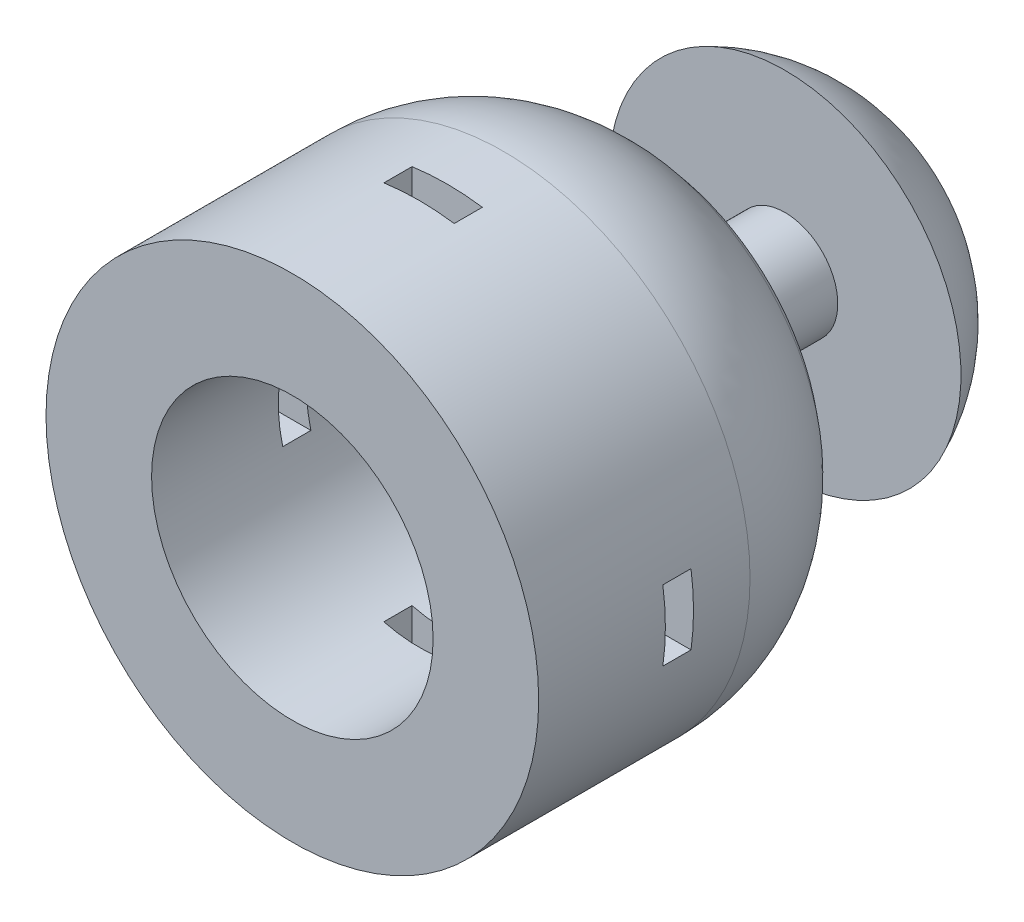
ISO-10303-21;
HEADER;
FILE_DESCRIPTION(('STEP AP214'),'2;1');
FILE_NAME('part.step','',(''),(''),'','','');
FILE_SCHEMA(('AUTOMOTIVE_DESIGN { 1 0 10303 214 1 1 1 1 }'));
ENDSEC;
DATA;
#1=APPLICATION_CONTEXT('core data for automotive mechanical design processes');
#2=APPLICATION_PROTOCOL_DEFINITION('international standard','automotive_design',2000,#1);
#3=PRODUCT_CONTEXT('',#1,'mechanical');
#4=PRODUCT('Part','Part','',(#3));
#5=PRODUCT_RELATED_PRODUCT_CATEGORY('part','',(#4));
#6=PRODUCT_DEFINITION_FORMATION('','',#4);
#7=PRODUCT_DEFINITION_CONTEXT('part definition',#1,'design');
#8=PRODUCT_DEFINITION('design','',#6,#7);
#9=PRODUCT_DEFINITION_SHAPE('','',#8);
#10=(LENGTH_UNIT() NAMED_UNIT(*) SI_UNIT(.MILLI.,.METRE.));
#11=(NAMED_UNIT(*) PLANE_ANGLE_UNIT() SI_UNIT($,.RADIAN.));
#12=(NAMED_UNIT(*) SI_UNIT($,.STERADIAN.) SOLID_ANGLE_UNIT());
#13=UNCERTAINTY_MEASURE_WITH_UNIT(LENGTH_MEASURE(1.E-05),#10,'distance_accuracy_value','');
#14=(GEOMETRIC_REPRESENTATION_CONTEXT(3) GLOBAL_UNCERTAINTY_ASSIGNED_CONTEXT((#13)) GLOBAL_UNIT_ASSIGNED_CONTEXT((#10,
#11,#12)) REPRESENTATION_CONTEXT('',''));
#15=CARTESIAN_POINT('',(0.,0.,0.));
#16=DIRECTION('',(0.,0.,1.));
#17=DIRECTION('',(1.,0.,0.));
#18=AXIS2_PLACEMENT_3D('',#15,#16,#17);
#19=CARTESIAN_POINT('',(0.,0.,400.));
#20=DIRECTION('',(0.,0.,1.));
#21=DIRECTION('',(1.,0.,0.));
#22=AXIS2_PLACEMENT_3D('',#19,#20,#21);
#23=PLANE('',#22);
#24=CARTESIAN_POINT('',(0.,0.,400.));
#25=DIRECTION('',(0.,0.,1.));
#26=DIRECTION('',(1.,0.,0.));
#27=AXIS2_PLACEMENT_3D('',#24,#25,#26);
#28=CIRCLE('',#27,350.);
#29=CARTESIAN_POINT('',(350.,0.,400.));
#30=VERTEX_POINT('',#29);
#31=EDGE_CURVE('E211',#30,#30,#28,.T.);
#32=ORIENTED_EDGE('',*,*,#31,.T.);
#33=EDGE_LOOP('',(#32));
#34=FACE_BOUND('',#33,.T.);
#35=CARTESIAN_POINT('',(0.,0.,400.));
#36=DIRECTION('',(0.,0.,1.));
#37=DIRECTION('',(1.,0.,0.));
#38=AXIS2_PLACEMENT_3D('',#35,#36,#37);
#39=CIRCLE('',#38,200.);
#40=CARTESIAN_POINT('',(200.,0.,400.));
#41=VERTEX_POINT('',#40);
#42=EDGE_CURVE('E213',#41,#41,#39,.T.);
#43=ORIENTED_EDGE('',*,*,#42,.F.);
#44=EDGE_LOOP('',(#43));
#45=FACE_BOUND('',#44,.T.);
#46=ADVANCED_FACE('F43',(#34,#45),#23,.T.);
#47=CARTESIAN_POINT('',(0.,0.,400.));
#48=DIRECTION('',(0.,0.,-1.));
#49=DIRECTION('',(-1.,0.,0.));
#50=AXIS2_PLACEMENT_3D('',#47,#48,#49);
#51=CYLINDRICAL_SURFACE('',#50,350.);
#52=CARTESIAN_POINT('',(0.,0.,99.7028411380288));
#53=DIRECTION('',(0.,0.,-1.));
#54=DIRECTION('',(-1.,0.,0.));
#55=AXIS2_PLACEMENT_3D('',#52,#53,#54);
#56=CIRCLE('',#55,350.);
#57=CARTESIAN_POINT('',(-350.,0.,99.7028411380288));
#58=VERTEX_POINT('',#57);
#59=EDGE_CURVE('E12',#58,#58,#56,.F.);
#60=ORIENTED_EDGE('',*,*,#59,.T.);
#61=EDGE_LOOP('',(#60));
#62=FACE_BOUND('',#61,.T.);
#63=DIRECTION('',(0.,0.,-1.));
#64=VECTOR('',#63,1.);
#65=CARTESIAN_POINT('',(-346.410161513775,50.,400.));
#66=LINE('',#65,#64);
#67=CARTESIAN_POINT('',(-346.410161513775,50.,180.));
#68=VERTEX_POINT('',#67);
#69=CARTESIAN_POINT('',(-346.410161513775,50.,220.));
#70=VERTEX_POINT('',#69);
#71=EDGE_CURVE('E259',#68,#70,#66,.F.);
#72=ORIENTED_EDGE('',*,*,#71,.T.);
#73=CARTESIAN_POINT('',(0.,0.,220.));
#74=DIRECTION('',(0.,0.,1.));
#75=DIRECTION('',(1.,0.,0.));
#76=AXIS2_PLACEMENT_3D('',#73,#74,#75);
#77=CIRCLE('',#76,350.);
#78=CARTESIAN_POINT('',(-346.410161513775,-50.,220.));
#79=VERTEX_POINT('',#78);
#80=EDGE_CURVE('E245',#70,#79,#77,.T.);
#81=ORIENTED_EDGE('',*,*,#80,.T.);
#82=DIRECTION('',(0.,0.,-1.));
#83=VECTOR('',#82,1.);
#84=CARTESIAN_POINT('',(-346.410161513775,-50.,400.));
#85=LINE('',#84,#83);
#86=CARTESIAN_POINT('',(-346.410161513775,-50.,180.));
#87=VERTEX_POINT('',#86);
#88=EDGE_CURVE('E262',#79,#87,#85,.T.);
#89=ORIENTED_EDGE('',*,*,#88,.T.);
#90=CARTESIAN_POINT('',(0.,0.,180.));
#91=DIRECTION('',(0.,0.,-1.));
#92=DIRECTION('',(-1.,0.,0.));
#93=AXIS2_PLACEMENT_3D('',#90,#91,#92);
#94=CIRCLE('',#93,350.);
#95=EDGE_CURVE('E171',#87,#68,#94,.T.);
#96=ORIENTED_EDGE('',*,*,#95,.T.);
#97=EDGE_LOOP('',(#72,#81,#89,#96));
#98=FACE_BOUND('',#97,.T.);
#99=CARTESIAN_POINT('',(346.410161513775,-50.,220.));
#100=VERTEX_POINT('',#99);
#101=CARTESIAN_POINT('',(346.410161513775,50.,220.));
#102=VERTEX_POINT('',#101);
#103=EDGE_CURVE('E253',#100,#102,#77,.T.);
#104=ORIENTED_EDGE('',*,*,#103,.T.);
#105=DIRECTION('',(0.,0.,-1.));
#106=VECTOR('',#105,1.);
#107=CARTESIAN_POINT('',(346.410161513775,50.,400.));
#108=LINE('',#107,#106);
#109=CARTESIAN_POINT('',(346.410161513775,50.,180.));
#110=VERTEX_POINT('',#109);
#111=EDGE_CURVE('E260',#102,#110,#108,.T.);
#112=ORIENTED_EDGE('',*,*,#111,.T.);
#113=CARTESIAN_POINT('',(346.410161513775,-50.,180.));
#114=VERTEX_POINT('',#113);
#115=EDGE_CURVE('E265',#110,#114,#94,.T.);
#116=ORIENTED_EDGE('',*,*,#115,.T.);
#117=DIRECTION('',(0.,0.,-1.));
#118=VECTOR('',#117,1.);
#119=CARTESIAN_POINT('',(346.410161513775,-50.,400.));
#120=LINE('',#119,#118);
#121=EDGE_CURVE('E270',#114,#100,#120,.F.);
#122=ORIENTED_EDGE('',*,*,#121,.T.);
#123=EDGE_LOOP('',(#104,#112,#116,#122));
#124=FACE_BOUND('',#123,.T.);
#125=DIRECTION('',(0.,0.,-1.));
#126=VECTOR('',#125,1.);
#127=CARTESIAN_POINT('',(-49.9999999999999,-346.410161513775,400.));
#128=LINE('',#127,#126);
#129=CARTESIAN_POINT('',(-49.9999999999999,-346.410161513775,180.));
#130=VERTEX_POINT('',#129);
#131=CARTESIAN_POINT('',(-49.9999999999999,-346.410161513775,220.));
#132=VERTEX_POINT('',#131);
#133=EDGE_CURVE('E222',#130,#132,#128,.F.);
#134=ORIENTED_EDGE('',*,*,#133,.T.);
#135=CARTESIAN_POINT('',(0.,0.,220.));
#136=DIRECTION('',(0.,0.,1.));
#137=DIRECTION('',(1.,0.,0.));
#138=AXIS2_PLACEMENT_3D('',#135,#136,#137);
#139=CIRCLE('',#138,350.);
#140=CARTESIAN_POINT('',(50.0000000000001,-346.410161513775,220.));
#141=VERTEX_POINT('',#140);
#142=EDGE_CURVE('E240',#132,#141,#139,.T.);
#143=ORIENTED_EDGE('',*,*,#142,.T.);
#144=DIRECTION('',(0.,0.,-1.));
#145=VECTOR('',#144,1.);
#146=CARTESIAN_POINT('',(50.0000000000001,-346.410161513775,400.));
#147=LINE('',#146,#145);
#148=CARTESIAN_POINT('',(50.0000000000001,-346.410161513775,180.));
#149=VERTEX_POINT('',#148);
#150=EDGE_CURVE('E230',#141,#149,#147,.T.);
#151=ORIENTED_EDGE('',*,*,#150,.T.);
#152=CARTESIAN_POINT('',(0.,0.,180.));
#153=DIRECTION('',(0.,0.,-1.));
#154=DIRECTION('',(-1.,0.,0.));
#155=AXIS2_PLACEMENT_3D('',#152,#153,#154);
#156=CIRCLE('',#155,350.);
#157=EDGE_CURVE('E226',#149,#130,#156,.T.);
#158=ORIENTED_EDGE('',*,*,#157,.T.);
#159=EDGE_LOOP('',(#134,#143,#151,#158));
#160=FACE_BOUND('',#159,.T.);
#161=DIRECTION('',(0.,0.,-1.));
#162=VECTOR('',#161,1.);
#163=CARTESIAN_POINT('',(50.0000000000001,346.410161513775,400.));
#164=LINE('',#163,#162);
#165=CARTESIAN_POINT('',(50.0000000000001,346.410161513775,180.));
#166=VERTEX_POINT('',#165);
#167=CARTESIAN_POINT('',(50.0000000000001,346.410161513775,220.));
#168=VERTEX_POINT('',#167);
#169=EDGE_CURVE('E235',#166,#168,#164,.F.);
#170=ORIENTED_EDGE('',*,*,#169,.T.);
#171=CARTESIAN_POINT('',(-49.9999999999999,346.410161513775,220.));
#172=VERTEX_POINT('',#171);
#173=EDGE_CURVE('E232',#168,#172,#139,.T.);
#174=ORIENTED_EDGE('',*,*,#173,.T.);
#175=DIRECTION('',(0.,0.,-1.));
#176=VECTOR('',#175,1.);
#177=CARTESIAN_POINT('',(-49.9999999999999,346.410161513775,400.));
#178=LINE('',#177,#176);
#179=CARTESIAN_POINT('',(-49.9999999999999,346.410161513775,180.));
#180=VERTEX_POINT('',#179);
#181=EDGE_CURVE('E220',#172,#180,#178,.T.);
#182=ORIENTED_EDGE('',*,*,#181,.T.);
#183=EDGE_CURVE('E228',#180,#166,#156,.T.);
#184=ORIENTED_EDGE('',*,*,#183,.T.);
#185=EDGE_LOOP('',(#170,#174,#182,#184));
#186=FACE_BOUND('',#185,.T.);
#187=ORIENTED_EDGE('',*,*,#31,.F.);
#188=EDGE_LOOP('',(#187));
#189=FACE_BOUND('',#188,.T.);
#190=ADVANCED_FACE('F307',(#62,#98,#124,#160,#186,#189),#51,.T.);
#191=CARTESIAN_POINT('',(0.,0.,400.));
#192=DIRECTION('',(0.,0.,-1.));
#193=DIRECTION('',(-1.,0.,0.));
#194=AXIS2_PLACEMENT_3D('',#191,#192,#193);
#195=CYLINDRICAL_SURFACE('',#194,200.);
#196=CARTESIAN_POINT('',(0.,0.,220.));
#197=DIRECTION('',(0.,0.,1.));
#198=DIRECTION('',(1.,0.,0.));
#199=AXIS2_PLACEMENT_3D('',#196,#197,#198);
#200=CIRCLE('',#199,200.);
#201=CARTESIAN_POINT('',(-193.649167310371,50.,220.));
#202=VERTEX_POINT('',#201);
#203=CARTESIAN_POINT('',(-193.649167310371,-50.,220.));
#204=VERTEX_POINT('',#203);
#205=EDGE_CURVE('E185',#202,#204,#200,.T.);
#206=ORIENTED_EDGE('',*,*,#205,.F.);
#207=DIRECTION('',(0.,0.,-1.));
#208=VECTOR('',#207,1.);
#209=CARTESIAN_POINT('',(-193.649167310371,50.,400.));
#210=LINE('',#209,#208);
#211=CARTESIAN_POINT('',(-193.649167310371,50.,180.));
#212=VERTEX_POINT('',#211);
#213=EDGE_CURVE('E177',#212,#202,#210,.F.);
#214=ORIENTED_EDGE('',*,*,#213,.F.);
#215=CARTESIAN_POINT('',(0.,0.,180.));
#216=DIRECTION('',(0.,0.,-1.));
#217=DIRECTION('',(-1.,0.,0.));
#218=AXIS2_PLACEMENT_3D('',#215,#216,#217);
#219=CIRCLE('',#218,200.);
#220=CARTESIAN_POINT('',(-193.649167310371,-50.,180.));
#221=VERTEX_POINT('',#220);
#222=EDGE_CURVE('E165',#221,#212,#219,.T.);
#223=ORIENTED_EDGE('',*,*,#222,.F.);
#224=DIRECTION('',(0.,0.,-1.));
#225=VECTOR('',#224,1.);
#226=CARTESIAN_POINT('',(-193.649167310371,-50.,400.));
#227=LINE('',#226,#225);
#228=EDGE_CURVE('E156',#204,#221,#227,.T.);
#229=ORIENTED_EDGE('',*,*,#228,.F.);
#230=EDGE_LOOP('',(#206,#214,#223,#229));
#231=FACE_BOUND('',#230,.T.);
#232=CARTESIAN_POINT('',(193.649167310371,-50.,220.));
#233=VERTEX_POINT('',#232);
#234=CARTESIAN_POINT('',(193.649167310371,50.,220.));
#235=VERTEX_POINT('',#234);
#236=EDGE_CURVE('E164',#233,#235,#200,.T.);
#237=ORIENTED_EDGE('',*,*,#236,.F.);
#238=DIRECTION('',(0.,0.,-1.));
#239=VECTOR('',#238,1.);
#240=CARTESIAN_POINT('',(193.649167310371,-50.,400.));
#241=LINE('',#240,#239);
#242=CARTESIAN_POINT('',(193.649167310371,-50.,180.));
#243=VERTEX_POINT('',#242);
#244=EDGE_CURVE('E189',#243,#233,#241,.F.);
#245=ORIENTED_EDGE('',*,*,#244,.F.);
#246=CARTESIAN_POINT('',(193.649167310371,50.,180.));
#247=VERTEX_POINT('',#246);
#248=EDGE_CURVE('E181',#247,#243,#219,.T.);
#249=ORIENTED_EDGE('',*,*,#248,.F.);
#250=DIRECTION('',(0.,0.,-1.));
#251=VECTOR('',#250,1.);
#252=CARTESIAN_POINT('',(193.649167310371,50.,400.));
#253=LINE('',#252,#251);
#254=EDGE_CURVE('E190',#235,#247,#253,.T.);
#255=ORIENTED_EDGE('',*,*,#254,.F.);
#256=EDGE_LOOP('',(#237,#245,#249,#255));
#257=FACE_BOUND('',#256,.T.);
#258=DIRECTION('',(0.,0.,-1.));
#259=VECTOR('',#258,1.);
#260=CARTESIAN_POINT('',(-49.9999999999999,193.649167310371,400.));
#261=LINE('',#260,#259);
#262=CARTESIAN_POINT('',(-49.9999999999999,193.649167310371,220.));
#263=VERTEX_POINT('',#262);
#264=CARTESIAN_POINT('',(-49.9999999999999,193.649167310371,180.));
#265=VERTEX_POINT('',#264);
#266=EDGE_CURVE('E193',#263,#265,#261,.T.);
#267=ORIENTED_EDGE('',*,*,#266,.F.);
#268=CARTESIAN_POINT('',(0.,0.,220.));
#269=DIRECTION('',(0.,0.,1.));
#270=DIRECTION('',(1.,0.,0.));
#271=AXIS2_PLACEMENT_3D('',#268,#269,#270);
#272=CIRCLE('',#271,200.);
#273=CARTESIAN_POINT('',(50.0000000000001,193.649167310371,220.));
#274=VERTEX_POINT('',#273);
#275=EDGE_CURVE('E203',#274,#263,#272,.T.);
#276=ORIENTED_EDGE('',*,*,#275,.F.);
#277=DIRECTION('',(0.,0.,-1.));
#278=VECTOR('',#277,1.);
#279=CARTESIAN_POINT('',(50.0000000000001,193.649167310371,400.));
#280=LINE('',#279,#278);
#281=CARTESIAN_POINT('',(50.0000000000001,193.649167310371,180.));
#282=VERTEX_POINT('',#281);
#283=EDGE_CURVE('E200',#282,#274,#280,.F.);
#284=ORIENTED_EDGE('',*,*,#283,.F.);
#285=CARTESIAN_POINT('',(0.,0.,180.));
#286=DIRECTION('',(0.,0.,-1.));
#287=DIRECTION('',(-1.,0.,0.));
#288=AXIS2_PLACEMENT_3D('',#285,#286,#287);
#289=CIRCLE('',#288,200.);
#290=EDGE_CURVE('E194',#265,#282,#289,.T.);
#291=ORIENTED_EDGE('',*,*,#290,.F.);
#292=EDGE_LOOP('',(#267,#276,#284,#291));
#293=FACE_BOUND('',#292,.T.);
#294=DIRECTION('',(0.,0.,-1.));
#295=VECTOR('',#294,1.);
#296=CARTESIAN_POINT('',(-49.9999999999999,-193.649167310371,400.));
#297=LINE('',#296,#295);
#298=CARTESIAN_POINT('',(-49.9999999999999,-193.649167310371,180.));
#299=VERTEX_POINT('',#298);
#300=CARTESIAN_POINT('',(-49.9999999999999,-193.649167310371,220.));
#301=VERTEX_POINT('',#300);
#302=EDGE_CURVE('E205',#299,#301,#297,.F.);
#303=ORIENTED_EDGE('',*,*,#302,.F.);
#304=CARTESIAN_POINT('',(50.0000000000001,-193.649167310371,180.));
#305=VERTEX_POINT('',#304);
#306=EDGE_CURVE('E202',#305,#299,#289,.T.);
#307=ORIENTED_EDGE('',*,*,#306,.F.);
#308=DIRECTION('',(0.,0.,-1.));
#309=VECTOR('',#308,1.);
#310=CARTESIAN_POINT('',(50.0000000000001,-193.649167310371,400.));
#311=LINE('',#310,#309);
#312=CARTESIAN_POINT('',(50.0000000000001,-193.649167310371,220.));
#313=VERTEX_POINT('',#312);
#314=EDGE_CURVE('E210',#313,#305,#311,.T.);
#315=ORIENTED_EDGE('',*,*,#314,.F.);
#316=EDGE_CURVE('E209',#301,#313,#272,.T.);
#317=ORIENTED_EDGE('',*,*,#316,.F.);
#318=EDGE_LOOP('',(#303,#307,#315,#317));
#319=FACE_BOUND('',#318,.T.);
#320=ORIENTED_EDGE('',*,*,#42,.T.);
#321=EDGE_LOOP('',(#320));
#322=FACE_BOUND('',#321,.T.);
#323=CARTESIAN_POINT('',(0.,0.,0.));
#324=DIRECTION('',(0.,0.,1.));
#325=DIRECTION('',(1.,0.,0.));
#326=AXIS2_PLACEMENT_3D('',#323,#324,#325);
#327=CIRCLE('',#326,200.);
#328=CARTESIAN_POINT('',(200.,0.,0.));
#329=VERTEX_POINT('',#328);
#330=EDGE_CURVE('E214',#329,#329,#327,.T.);
#331=ORIENTED_EDGE('',*,*,#330,.F.);
#332=EDGE_LOOP('',(#331));
#333=FACE_BOUND('',#332,.T.);
#334=ADVANCED_FACE('F180',(#231,#257,#293,#319,#322,#333),#195,.F.);
#335=CARTESIAN_POINT('',(50.0000000000001,-350.,220.));
#336=DIRECTION('',(0.,0.,1.));
#337=DIRECTION('',(1.,0.,0.));
#338=AXIS2_PLACEMENT_3D('',#335,#336,#337);
#339=PLANE('',#338);
#340=DIRECTION('',(0.,1.,0.));
#341=VECTOR('',#340,1.);
#342=CARTESIAN_POINT('',(-49.9999999999999,-350.,220.));
#343=LINE('',#342,#341);
#344=EDGE_CURVE('E241',#132,#301,#343,.T.);
#345=ORIENTED_EDGE('',*,*,#344,.T.);
#346=ORIENTED_EDGE('',*,*,#316,.T.);
#347=DIRECTION('',(0.,1.,0.));
#348=VECTOR('',#347,1.);
#349=CARTESIAN_POINT('',(50.0000000000001,-350.,220.));
#350=LINE('',#349,#348);
#351=EDGE_CURVE('E246',#141,#313,#350,.T.);
#352=ORIENTED_EDGE('',*,*,#351,.F.);
#353=ORIENTED_EDGE('',*,*,#142,.F.);
#354=EDGE_LOOP('',(#345,#346,#352,#353));
#355=FACE_BOUND('',#354,.T.);
#356=ADVANCED_FACE('F388',(#355),#339,.F.);
#357=CARTESIAN_POINT('',(50.0000000000001,-350.,220.));
#358=DIRECTION('',(1.,0.,0.));
#359=DIRECTION('',(0.,0.,-1.));
#360=AXIS2_PLACEMENT_3D('',#357,#358,#359);
#361=PLANE('',#360);
#362=ORIENTED_EDGE('',*,*,#351,.T.);
#363=ORIENTED_EDGE('',*,*,#314,.T.);
#364=DIRECTION('',(0.,1.,0.));
#365=VECTOR('',#364,1.);
#366=CARTESIAN_POINT('',(50.0000000000001,-350.,180.));
#367=LINE('',#366,#365);
#368=EDGE_CURVE('E249',#149,#305,#367,.T.);
#369=ORIENTED_EDGE('',*,*,#368,.F.);
#370=ORIENTED_EDGE('',*,*,#150,.F.);
#371=EDGE_LOOP('',(#362,#363,#369,#370));
#372=FACE_BOUND('',#371,.T.);
#373=ADVANCED_FACE('F389',(#372),#361,.F.);
#374=CARTESIAN_POINT('',(50.0000000000001,-350.,180.));
#375=DIRECTION('',(0.,0.,-1.));
#376=DIRECTION('',(-1.,0.,0.));
#377=AXIS2_PLACEMENT_3D('',#374,#375,#376);
#378=PLANE('',#377);
#379=ORIENTED_EDGE('',*,*,#368,.T.);
#380=ORIENTED_EDGE('',*,*,#306,.T.);
#381=DIRECTION('',(0.,1.,0.));
#382=VECTOR('',#381,1.);
#383=CARTESIAN_POINT('',(-49.9999999999999,-350.,180.));
#384=LINE('',#383,#382);
#385=EDGE_CURVE('E251',#130,#299,#384,.T.);
#386=ORIENTED_EDGE('',*,*,#385,.F.);
#387=ORIENTED_EDGE('',*,*,#157,.F.);
#388=EDGE_LOOP('',(#379,#380,#386,#387));
#389=FACE_BOUND('',#388,.T.);
#390=ADVANCED_FACE('F384',(#389),#378,.F.);
#391=CARTESIAN_POINT('',(-49.9999999999999,-350.,220.));
#392=DIRECTION('',(-1.,0.,0.));
#393=DIRECTION('',(0.,0.,1.));
#394=AXIS2_PLACEMENT_3D('',#391,#392,#393);
#395=PLANE('',#394);
#396=ORIENTED_EDGE('',*,*,#385,.T.);
#397=ORIENTED_EDGE('',*,*,#302,.T.);
#398=ORIENTED_EDGE('',*,*,#344,.F.);
#399=ORIENTED_EDGE('',*,*,#133,.F.);
#400=EDGE_LOOP('',(#396,#397,#398,#399));
#401=FACE_BOUND('',#400,.T.);
#402=ADVANCED_FACE('F380',(#401),#395,.F.);
#403=EDGE_CURVE('E238',#263,#172,#343,.T.);
#404=ORIENTED_EDGE('',*,*,#403,.F.);
#405=ORIENTED_EDGE('',*,*,#266,.T.);
#406=EDGE_CURVE('E252',#265,#180,#384,.T.);
#407=ORIENTED_EDGE('',*,*,#406,.T.);
#408=ORIENTED_EDGE('',*,*,#181,.F.);
#409=EDGE_LOOP('',(#404,#405,#407,#408));
#410=FACE_BOUND('',#409,.T.);
#411=ADVANCED_FACE('F374',(#410),#395,.F.);
#412=ORIENTED_EDGE('',*,*,#406,.F.);
#413=ORIENTED_EDGE('',*,*,#290,.T.);
#414=EDGE_CURVE('E250',#282,#166,#367,.T.);
#415=ORIENTED_EDGE('',*,*,#414,.T.);
#416=ORIENTED_EDGE('',*,*,#183,.F.);
#417=EDGE_LOOP('',(#412,#413,#415,#416));
#418=FACE_BOUND('',#417,.T.);
#419=ADVANCED_FACE('F364',(#418),#378,.F.);
#420=ORIENTED_EDGE('',*,*,#414,.F.);
#421=ORIENTED_EDGE('',*,*,#283,.T.);
#422=EDGE_CURVE('E243',#274,#168,#350,.T.);
#423=ORIENTED_EDGE('',*,*,#422,.T.);
#424=ORIENTED_EDGE('',*,*,#169,.F.);
#425=EDGE_LOOP('',(#420,#421,#423,#424));
#426=FACE_BOUND('',#425,.T.);
#427=ADVANCED_FACE('F359',(#426),#361,.F.);
#428=ORIENTED_EDGE('',*,*,#422,.F.);
#429=ORIENTED_EDGE('',*,*,#275,.T.);
#430=ORIENTED_EDGE('',*,*,#403,.T.);
#431=ORIENTED_EDGE('',*,*,#173,.F.);
#432=EDGE_LOOP('',(#428,#429,#430,#431));
#433=FACE_BOUND('',#432,.T.);
#434=ADVANCED_FACE('F375',(#433),#339,.F.);
#435=CARTESIAN_POINT('',(-350.,-50.,180.));
#436=DIRECTION('',(0.,-1.,0.));
#437=DIRECTION('',(0.,0.,-1.));
#438=AXIS2_PLACEMENT_3D('',#435,#436,#437);
#439=PLANE('',#438);
#440=DIRECTION('',(1.,0.,0.));
#441=VECTOR('',#440,1.);
#442=CARTESIAN_POINT('',(-350.,-50.,180.));
#443=LINE('',#442,#441);
#444=EDGE_CURVE('E172',#243,#114,#443,.T.);
#445=ORIENTED_EDGE('',*,*,#444,.F.);
#446=ORIENTED_EDGE('',*,*,#244,.T.);
#447=DIRECTION('',(1.,0.,0.));
#448=VECTOR('',#447,1.);
#449=CARTESIAN_POINT('',(-350.,-50.,220.));
#450=LINE('',#449,#448);
#451=EDGE_CURVE('E69',#233,#100,#450,.T.);
#452=ORIENTED_EDGE('',*,*,#451,.T.);
#453=ORIENTED_EDGE('',*,*,#121,.F.);
#454=EDGE_LOOP('',(#445,#446,#452,#453));
#455=FACE_BOUND('',#454,.T.);
#456=ADVANCED_FACE('F387',(#455),#439,.F.);
#457=CARTESIAN_POINT('',(-350.,-50.,180.));
#458=DIRECTION('',(0.,0.,-1.));
#459=DIRECTION('',(-1.,0.,0.));
#460=AXIS2_PLACEMENT_3D('',#457,#458,#459);
#461=PLANE('',#460);
#462=DIRECTION('',(1.,0.,0.));
#463=VECTOR('',#462,1.);
#464=CARTESIAN_POINT('',(-350.,50.,180.));
#465=LINE('',#464,#463);
#466=EDGE_CURVE('E173',#247,#110,#465,.T.);
#467=ORIENTED_EDGE('',*,*,#466,.F.);
#468=ORIENTED_EDGE('',*,*,#248,.T.);
#469=ORIENTED_EDGE('',*,*,#444,.T.);
#470=ORIENTED_EDGE('',*,*,#115,.F.);
#471=EDGE_LOOP('',(#467,#468,#469,#470));
#472=FACE_BOUND('',#471,.T.);
#473=ADVANCED_FACE('F397',(#472),#461,.F.);
#474=CARTESIAN_POINT('',(-350.,50.,180.));
#475=DIRECTION('',(0.,1.,0.));
#476=DIRECTION('',(0.,0.,1.));
#477=AXIS2_PLACEMENT_3D('',#474,#475,#476);
#478=PLANE('',#477);
#479=DIRECTION('',(1.,0.,0.));
#480=VECTOR('',#479,1.);
#481=CARTESIAN_POINT('',(-350.,50.,220.));
#482=LINE('',#481,#480);
#483=EDGE_CURVE('E276',#235,#102,#482,.T.);
#484=ORIENTED_EDGE('',*,*,#483,.F.);
#485=ORIENTED_EDGE('',*,*,#254,.T.);
#486=ORIENTED_EDGE('',*,*,#466,.T.);
#487=ORIENTED_EDGE('',*,*,#111,.F.);
#488=EDGE_LOOP('',(#484,#485,#486,#487));
#489=FACE_BOUND('',#488,.T.);
#490=ADVANCED_FACE('F401',(#489),#478,.F.);
#491=CARTESIAN_POINT('',(-350.,-50.,220.));
#492=DIRECTION('',(0.,0.,1.));
#493=DIRECTION('',(1.,0.,0.));
#494=AXIS2_PLACEMENT_3D('',#491,#492,#493);
#495=PLANE('',#494);
#496=ORIENTED_EDGE('',*,*,#103,.F.);
#497=ORIENTED_EDGE('',*,*,#451,.F.);
#498=ORIENTED_EDGE('',*,*,#236,.T.);
#499=ORIENTED_EDGE('',*,*,#483,.T.);
#500=EDGE_LOOP('',(#496,#497,#498,#499));
#501=FACE_BOUND('',#500,.T.);
#502=ADVANCED_FACE('F398',(#501),#495,.F.);
#503=EDGE_CURVE('E267',#70,#202,#482,.T.);
#504=ORIENTED_EDGE('',*,*,#503,.T.);
#505=ORIENTED_EDGE('',*,*,#205,.T.);
#506=EDGE_CURVE('E158',#79,#204,#450,.T.);
#507=ORIENTED_EDGE('',*,*,#506,.F.);
#508=ORIENTED_EDGE('',*,*,#80,.F.);
#509=EDGE_LOOP('',(#504,#505,#507,#508));
#510=FACE_BOUND('',#509,.T.);
#511=ADVANCED_FACE('F343',(#510),#495,.F.);
#512=EDGE_CURVE('E273',#68,#212,#465,.T.);
#513=ORIENTED_EDGE('',*,*,#512,.T.);
#514=ORIENTED_EDGE('',*,*,#213,.T.);
#515=ORIENTED_EDGE('',*,*,#503,.F.);
#516=ORIENTED_EDGE('',*,*,#71,.F.);
#517=EDGE_LOOP('',(#513,#514,#515,#516));
#518=FACE_BOUND('',#517,.T.);
#519=ADVANCED_FACE('F350',(#518),#478,.F.);
#520=ORIENTED_EDGE('',*,*,#95,.F.);
#521=EDGE_CURVE('E59',#87,#221,#443,.T.);
#522=ORIENTED_EDGE('',*,*,#521,.T.);
#523=ORIENTED_EDGE('',*,*,#222,.T.);
#524=ORIENTED_EDGE('',*,*,#512,.F.);
#525=EDGE_LOOP('',(#520,#522,#523,#524));
#526=FACE_BOUND('',#525,.T.);
#527=ADVANCED_FACE('F166',(#526),#461,.F.);
#528=ORIENTED_EDGE('',*,*,#506,.T.);
#529=ORIENTED_EDGE('',*,*,#228,.T.);
#530=ORIENTED_EDGE('',*,*,#521,.F.);
#531=ORIENTED_EDGE('',*,*,#88,.F.);
#532=EDGE_LOOP('',(#528,#529,#530,#531));
#533=FACE_BOUND('',#532,.T.);
#534=ADVANCED_FACE('F160',(#533),#439,.F.);
#535=CARTESIAN_POINT('',(0.,0.,0.));
#536=DIRECTION('',(0.,0.,-1.));
#537=DIRECTION('',(-1.,0.,0.));
#538=AXIS2_PLACEMENT_3D('',#535,#536,#537);
#539=PLANE('',#538);
#540=ORIENTED_EDGE('',*,*,#330,.T.);
#541=EDGE_LOOP('',(#540));
#542=FACE_BOUND('',#541,.T.);
#543=ADVANCED_FACE('F399',(#542),#539,.F.);
#544=CARTESIAN_POINT('',(0.,0.,-150.));
#545=DIRECTION('',(0.,0.,-1.));
#546=DIRECTION('',(-1.,0.,0.));
#547=AXIS2_PLACEMENT_3D('',#544,#545,#546);
#548=PLANE('',#547);
#549=CARTESIAN_POINT('',(0.,0.,-150.));
#550=DIRECTION('',(0.,0.,-1.));
#551=DIRECTION('',(-1.,0.,0.));
#552=AXIS2_PLACEMENT_3D('',#549,#550,#551);
#553=CIRCLE('',#552,100.318750936286);
#554=CARTESIAN_POINT('',(-100.318750936286,0.,-150.));
#555=VERTEX_POINT('',#554);
#556=EDGE_CURVE('E331',#555,#555,#553,.T.);
#557=ORIENTED_EDGE('',*,*,#556,.T.);
#558=EDGE_LOOP('',(#557));
#559=FACE_BOUND('',#558,.T.);
#560=CARTESIAN_POINT('',(0.,0.,-150.));
#561=DIRECTION('',(0.,0.,-1.));
#562=DIRECTION('',(-1.,0.,0.));
#563=AXIS2_PLACEMENT_3D('',#560,#561,#562);
#564=CIRCLE('',#563,75.);
#565=CARTESIAN_POINT('',(-75.,0.,-150.));
#566=VERTEX_POINT('',#565);
#567=EDGE_CURVE('E278',#566,#566,#564,.T.);
#568=ORIENTED_EDGE('',*,*,#567,.F.);
#569=EDGE_LOOP('',(#568));
#570=FACE_BOUND('',#569,.T.);
#571=ADVANCED_FACE('F408',(#559,#570),#548,.T.);
#572=CARTESIAN_POINT('',(0.,0.,-300.));
#573=DIRECTION('',(0.,0.,1.));
#574=DIRECTION('',(1.,0.,0.));
#575=AXIS2_PLACEMENT_3D('',#572,#573,#574);
#576=CYLINDRICAL_SURFACE('',#575,75.);
#577=CARTESIAN_POINT('',(0.,0.,-300.));
#578=DIRECTION('',(0.,0.,-1.));
#579=DIRECTION('',(-1.,0.,0.));
#580=AXIS2_PLACEMENT_3D('',#577,#578,#579);
#581=CIRCLE('',#580,75.);
#582=CARTESIAN_POINT('',(-75.,0.,-300.));
#583=VERTEX_POINT('',#582);
#584=EDGE_CURVE('E272',#583,#583,#581,.T.);
#585=ORIENTED_EDGE('',*,*,#584,.F.);
#586=EDGE_LOOP('',(#585));
#587=FACE_BOUND('',#586,.T.);
#588=ORIENTED_EDGE('',*,*,#567,.T.);
#589=EDGE_LOOP('',(#588));
#590=FACE_BOUND('',#589,.T.);
#591=ADVANCED_FACE('F302',(#587,#590),#576,.T.);
#592=CARTESIAN_POINT('',(0.,0.,-450.));
#593=DIRECTION('',(0.,0.,-1.));
#594=DIRECTION('',(-1.,0.,0.));
#595=AXIS2_PLACEMENT_3D('',#592,#593,#594);
#596=PLANE('',#595);
#597=CARTESIAN_POINT('',(0.,0.,-450.));
#598=DIRECTION('',(0.,0.,-1.));
#599=DIRECTION('',(-1.,0.,0.));
#600=AXIS2_PLACEMENT_3D('',#597,#598,#599);
#601=CIRCLE('',#600,20.871215252208);
#602=CARTESIAN_POINT('',(-20.871215252208,0.,-450.));
#603=VERTEX_POINT('',#602);
#604=EDGE_CURVE('E281',#603,#603,#601,.T.);
#605=ORIENTED_EDGE('',*,*,#604,.T.);
#606=EDGE_LOOP('',(#605));
#607=FACE_BOUND('',#606,.T.);
#608=ADVANCED_FACE('F295',(#607),#596,.T.);
#609=CARTESIAN_POINT('',(0.,0.,-300.));
#610=DIRECTION('',(0.,0.,-1.));
#611=DIRECTION('',(-1.,0.,0.));
#612=AXIS2_PLACEMENT_3D('',#609,#610,#611);
#613=PLANE('',#612);
#614=ORIENTED_EDGE('',*,*,#584,.T.);
#615=EDGE_LOOP('',(#614));
#616=FACE_BOUND('',#615,.T.);
#617=CARTESIAN_POINT('',(0.,0.,-300.));
#618=DIRECTION('',(0.,0.,-1.));
#619=DIRECTION('',(-1.,0.,0.));
#620=AXIS2_PLACEMENT_3D('',#617,#618,#619);
#621=CIRCLE('',#620,250.);
#622=CARTESIAN_POINT('',(-250.,0.,-300.));
#623=VERTEX_POINT('',#622);
#624=EDGE_CURVE('E282',#623,#623,#621,.T.);
#625=ORIENTED_EDGE('',*,*,#624,.F.);
#626=EDGE_LOOP('',(#625));
#627=FACE_BOUND('',#626,.T.);
#628=ADVANCED_FACE('F292',(#616,#627),#613,.F.);
#629=CARTESIAN_POINT('',(0.,0.,-200.));
#630=DIRECTION('',(0.,0.,1.));
#631=DIRECTION('',(1.,0.,0.));
#632=AXIS2_PLACEMENT_3D('',#629,#630,#631);
#633=DEGENERATE_TOROIDAL_SURFACE('',#632,20.871215252208,250.,.T.);
#634=ORIENTED_EDGE('',*,*,#624,.T.);
#635=EDGE_LOOP('',(#634));
#636=FACE_BOUND('',#635,.T.);
#637=ORIENTED_EDGE('',*,*,#604,.F.);
#638=EDGE_LOOP('',(#637));
#639=FACE_BOUND('',#638,.T.);
#640=ADVANCED_FACE('F288',(#636,#639),#633,.T.);
#641=CARTESIAN_POINT('',(0.,0.,100.));
#642=DIRECTION('',(0.,0.,1.));
#643=DIRECTION('',(1.,0.,0.));
#644=AXIS2_PLACEMENT_3D('',#641,#642,#643);
#645=DEGENERATE_TOROIDAL_SURFACE('',#644,100.318750936286,250.,.T.);
#646=CARTESIAN_POINT('',(0.,0.,-83.0101669577772));
#647=DIRECTION('',(0.,0.,1.));
#648=DIRECTION('',(1.,0.,0.));
#649=AXIS2_PLACEMENT_3D('',#646,#647,#648);
#650=CIRCLE('',#649,270.633984518272);
#651=CARTESIAN_POINT('',(270.633984518272,0.,-83.0101669577772));
#652=VERTEX_POINT('',#651);
#653=EDGE_CURVE('E51',#652,#652,#650,.T.);
#654=ORIENTED_EDGE('',*,*,#653,.F.);
#655=EDGE_LOOP('',(#654));
#656=FACE_BOUND('',#655,.T.);
#657=ORIENTED_EDGE('',*,*,#556,.F.);
#658=EDGE_LOOP('',(#657));
#659=FACE_BOUND('',#658,.T.);
#660=ADVANCED_FACE('F305',(#656,#659),#645,.T.);
#661=CARTESIAN_POINT('',(0.,0.,99.7028411380288));
#662=DIRECTION('',(0.,0.,-1.));
#663=DIRECTION('',(-1.,0.,0.));
#664=AXIS2_PLACEMENT_3D('',#661,#662,#663);
#665=DEGENERATE_TOROIDAL_SURFACE('',#664,100.,250.,.T.);
#666=ORIENTED_EDGE('',*,*,#59,.F.);
#667=EDGE_LOOP('',(#666));
#668=FACE_BOUND('',#667,.T.);
#669=ORIENTED_EDGE('',*,*,#653,.T.);
#670=EDGE_LOOP('',(#669));
#671=FACE_BOUND('',#670,.T.);
#672=ADVANCED_FACE('F44',(#668,#671),#665,.T.);
#673=CLOSED_SHELL('',(#46,#190,#334,#356,#373,#390,#402,#411,#419,#427,#434,#456,#473,#490,#502,
#511,#519,#527,#534,#543,#571,#591,#608,#628,#640,#660,#672));
#674=MANIFOLD_SOLID_BREP('B2',#673);
#675=ADVANCED_BREP_SHAPE_REPRESENTATION('',(#18,#674),#14);
#676=SHAPE_DEFINITION_REPRESENTATION(#9,#675);
ENDSEC;
END-ISO-10303-21;
